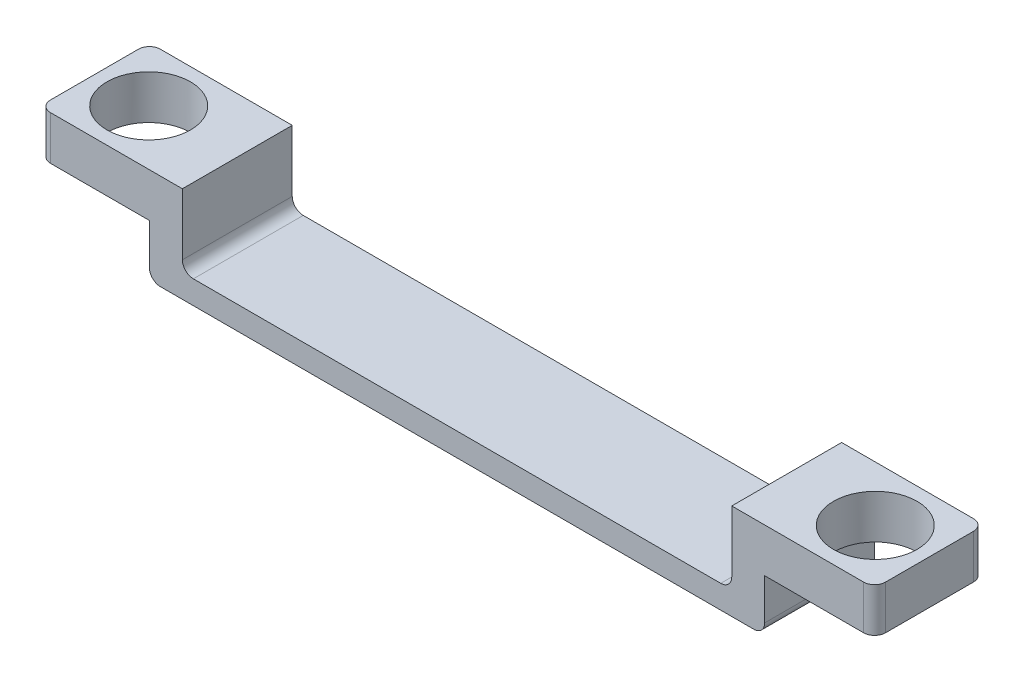
ISO-10303-21;
HEADER;
FILE_DESCRIPTION(('STEP AP214'),'2;1');
FILE_NAME('part.step','',(''),(''),'','','');
FILE_SCHEMA(('AUTOMOTIVE_DESIGN { 1 0 10303 214 1 1 1 1 }'));
ENDSEC;
DATA;
#1=APPLICATION_CONTEXT('core data for automotive mechanical design processes');
#2=APPLICATION_PROTOCOL_DEFINITION('international standard','automotive_design',2000,#1);
#3=PRODUCT_CONTEXT('',#1,'mechanical');
#4=PRODUCT('Part','Part','',(#3));
#5=PRODUCT_RELATED_PRODUCT_CATEGORY('part','',(#4));
#6=PRODUCT_DEFINITION_FORMATION('','',#4);
#7=PRODUCT_DEFINITION_CONTEXT('part definition',#1,'design');
#8=PRODUCT_DEFINITION('design','',#6,#7);
#9=PRODUCT_DEFINITION_SHAPE('','',#8);
#10=(LENGTH_UNIT() NAMED_UNIT(*) SI_UNIT(.MILLI.,.METRE.));
#11=(NAMED_UNIT(*) PLANE_ANGLE_UNIT() SI_UNIT($,.RADIAN.));
#12=(NAMED_UNIT(*) SI_UNIT($,.STERADIAN.) SOLID_ANGLE_UNIT());
#13=UNCERTAINTY_MEASURE_WITH_UNIT(LENGTH_MEASURE(1.E-05),#10,'distance_accuracy_value','');
#14=(GEOMETRIC_REPRESENTATION_CONTEXT(3) GLOBAL_UNCERTAINTY_ASSIGNED_CONTEXT((#13)) GLOBAL_UNIT_ASSIGNED_CONTEXT((#10,
#11,#12)) REPRESENTATION_CONTEXT('',''));
#15=CARTESIAN_POINT('',(0.,0.,0.));
#16=DIRECTION('',(0.,0.,1.));
#17=DIRECTION('',(1.,0.,0.));
#18=AXIS2_PLACEMENT_3D('',#15,#16,#17);
#19=CARTESIAN_POINT('',(22.3788372093023,2.89325581395349,5.));
#20=DIRECTION('',(-1.,0.,0.));
#21=DIRECTION('',(0.,-1.,0.));
#22=AXIS2_PLACEMENT_3D('',#19,#20,#21);
#23=PLANE('',#22);
#24=DIRECTION('',(0.,0.,1.));
#25=VECTOR('',#24,1.);
#26=CARTESIAN_POINT('',(22.3788372093023,0.89325581395349,0.));
#27=LINE('',#26,#25);
#28=CARTESIAN_POINT('',(22.3788372093023,0.89325581395349,0.));
#29=VERTEX_POINT('',#28);
#30=CARTESIAN_POINT('',(22.3788372093023,0.89325581395349,5.));
#31=VERTEX_POINT('',#30);
#32=EDGE_CURVE('E60',#29,#31,#27,.T.);
#33=ORIENTED_EDGE('',*,*,#32,.T.);
#34=DIRECTION('',(0.,1.,0.));
#35=VECTOR('',#34,1.);
#36=CARTESIAN_POINT('',(22.3788372093023,2.89325581395349,5.));
#37=LINE('',#36,#35);
#38=CARTESIAN_POINT('',(22.3788372093023,-0.965813953488363,5.));
#39=VERTEX_POINT('',#38);
#40=EDGE_CURVE('E275',#39,#31,#37,.T.);
#41=ORIENTED_EDGE('',*,*,#40,.F.);
#42=DIRECTION('',(0.,0.,-1.));
#43=VECTOR('',#42,1.);
#44=CARTESIAN_POINT('',(22.3788372093023,-0.965813953488363,5.));
#45=LINE('',#44,#43);
#46=CARTESIAN_POINT('',(22.3788372093023,-0.965813953488363,0.));
#47=VERTEX_POINT('',#46);
#48=EDGE_CURVE('E329',#39,#47,#45,.T.);
#49=ORIENTED_EDGE('',*,*,#48,.T.);
#50=DIRECTION('',(0.,1.,0.));
#51=VECTOR('',#50,1.);
#52=CARTESIAN_POINT('',(22.3788372093023,2.89325581395349,0.));
#53=LINE('',#52,#51);
#54=EDGE_CURVE('E297',#47,#29,#53,.T.);
#55=ORIENTED_EDGE('',*,*,#54,.T.);
#56=EDGE_LOOP('',(#33,#41,#49,#55));
#57=FACE_BOUND('',#56,.T.);
#58=ADVANCED_FACE('F43',(#57),#23,.F.);
#59=CARTESIAN_POINT('',(-5.62116279069767,-0.965813953488367,5.));
#60=DIRECTION('',(1.,0.,0.));
#61=DIRECTION('',(0.,0.,-1.));
#62=AXIS2_PLACEMENT_3D('',#59,#60,#61);
#63=PLANE('',#62);
#64=DIRECTION('',(0.,-1.,0.));
#65=VECTOR('',#64,1.);
#66=CARTESIAN_POINT('',(-5.62116279069767,-0.965813953488367,5.));
#67=LINE('',#66,#65);
#68=CARTESIAN_POINT('',(-5.62116279069767,0.89325581395349,5.));
#69=VERTEX_POINT('',#68);
#70=CARTESIAN_POINT('',(-5.62116279069767,-0.965813953488371,5.));
#71=VERTEX_POINT('',#70);
#72=EDGE_CURVE('E68',#69,#71,#67,.T.);
#73=ORIENTED_EDGE('',*,*,#72,.F.);
#74=DIRECTION('',(0.,0.,-1.));
#75=VECTOR('',#74,1.);
#76=CARTESIAN_POINT('',(-5.62116279069767,0.89325581395349,0.));
#77=LINE('',#76,#75);
#78=CARTESIAN_POINT('',(-5.62116279069767,0.89325581395349,0.));
#79=VERTEX_POINT('',#78);
#80=EDGE_CURVE('E193',#69,#79,#77,.T.);
#81=ORIENTED_EDGE('',*,*,#80,.T.);
#82=DIRECTION('',(0.,-1.,0.));
#83=VECTOR('',#82,1.);
#84=CARTESIAN_POINT('',(-5.62116279069767,-0.965813953488367,0.));
#85=LINE('',#84,#83);
#86=CARTESIAN_POINT('',(-5.62116279069767,-0.965813953488371,0.));
#87=VERTEX_POINT('',#86);
#88=EDGE_CURVE('E184',#79,#87,#85,.T.);
#89=ORIENTED_EDGE('',*,*,#88,.T.);
#90=DIRECTION('',(0.,0.,-1.));
#91=VECTOR('',#90,1.);
#92=CARTESIAN_POINT('',(-5.62116279069767,-0.965813953488371,5.));
#93=LINE('',#92,#91);
#94=EDGE_CURVE('E11',#71,#87,#93,.T.);
#95=ORIENTED_EDGE('',*,*,#94,.F.);
#96=EDGE_LOOP('',(#73,#81,#89,#95));
#97=FACE_BOUND('',#96,.T.);
#98=ADVANCED_FACE('F45',(#97),#63,.F.);
#99=CARTESIAN_POINT('',(-5.12116279069768,-0.965813953488371,5.));
#100=DIRECTION('',(0.,0.,-1.));
#101=DIRECTION('',(-1.,0.,0.));
#102=AXIS2_PLACEMENT_3D('',#99,#100,#101);
#103=CYLINDRICAL_SURFACE('',#102,0.5);
#104=CARTESIAN_POINT('',(-5.12116279069768,-0.965813953488371,0.));
#105=DIRECTION('',(0.,0.,1.));
#106=DIRECTION('',(-1.,0.,0.));
#107=AXIS2_PLACEMENT_3D('',#104,#105,#106);
#108=CIRCLE('',#107,0.5);
#109=CARTESIAN_POINT('',(-5.12116279069767,-1.46581395348837,0.));
#110=VERTEX_POINT('',#109);
#111=EDGE_CURVE('E190',#87,#110,#108,.T.);
#112=ORIENTED_EDGE('',*,*,#111,.T.);
#113=DIRECTION('',(0.,0.,-1.));
#114=VECTOR('',#113,1.);
#115=CARTESIAN_POINT('',(-5.12116279069767,-1.46581395348837,5.));
#116=LINE('',#115,#114);
#117=CARTESIAN_POINT('',(-5.12116279069767,-1.46581395348837,5.));
#118=VERTEX_POINT('',#117);
#119=EDGE_CURVE('E52',#118,#110,#116,.T.);
#120=ORIENTED_EDGE('',*,*,#119,.F.);
#121=CARTESIAN_POINT('',(-5.12116279069768,-0.965813953488371,5.));
#122=DIRECTION('',(0.,0.,1.));
#123=DIRECTION('',(-1.,0.,0.));
#124=AXIS2_PLACEMENT_3D('',#121,#122,#123);
#125=CIRCLE('',#124,0.5);
#126=EDGE_CURVE('E268',#71,#118,#125,.T.);
#127=ORIENTED_EDGE('',*,*,#126,.F.);
#128=ORIENTED_EDGE('',*,*,#94,.T.);
#129=EDGE_LOOP('',(#112,#120,#127,#128));
#130=FACE_BOUND('',#129,.T.);
#131=ADVANCED_FACE('F407',(#130),#103,.T.);
#132=CARTESIAN_POINT('',(21.8788372093023,-1.46581395348837,5.));
#133=DIRECTION('',(0.,1.,0.));
#134=DIRECTION('',(-1.,0.,0.));
#135=AXIS2_PLACEMENT_3D('',#132,#133,#134);
#136=PLANE('',#135);
#137=DIRECTION('',(1.,0.,0.));
#138=VECTOR('',#137,1.);
#139=CARTESIAN_POINT('',(21.8788372093023,-1.46581395348837,0.));
#140=LINE('',#139,#138);
#141=CARTESIAN_POINT('',(21.8788372093023,-1.46581395348837,0.));
#142=VERTEX_POINT('',#141);
#143=EDGE_CURVE('E293',#110,#142,#140,.T.);
#144=ORIENTED_EDGE('',*,*,#143,.T.);
#145=DIRECTION('',(0.,0.,-1.));
#146=VECTOR('',#145,1.);
#147=CARTESIAN_POINT('',(21.8788372093023,-1.46581395348837,5.));
#148=LINE('',#147,#146);
#149=CARTESIAN_POINT('',(21.8788372093023,-1.46581395348837,5.));
#150=VERTEX_POINT('',#149);
#151=EDGE_CURVE('E332',#150,#142,#148,.T.);
#152=ORIENTED_EDGE('',*,*,#151,.F.);
#153=DIRECTION('',(1.,0.,0.));
#154=VECTOR('',#153,1.);
#155=CARTESIAN_POINT('',(21.8788372093023,-1.46581395348837,5.));
#156=LINE('',#155,#154);
#157=EDGE_CURVE('E271',#118,#150,#156,.T.);
#158=ORIENTED_EDGE('',*,*,#157,.F.);
#159=ORIENTED_EDGE('',*,*,#119,.T.);
#160=EDGE_LOOP('',(#144,#152,#158,#159));
#161=FACE_BOUND('',#160,.T.);
#162=ADVANCED_FACE('F402',(#161),#136,.F.);
#163=CARTESIAN_POINT('',(21.8788372093023,-0.965813953488367,5.));
#164=DIRECTION('',(0.,0.,-1.));
#165=DIRECTION('',(-1.,0.,0.));
#166=AXIS2_PLACEMENT_3D('',#163,#164,#165);
#167=CYLINDRICAL_SURFACE('',#166,0.5);
#168=CARTESIAN_POINT('',(21.8788372093023,-0.965813953488367,0.));
#169=DIRECTION('',(0.,0.,1.));
#170=DIRECTION('',(-1.,0.,0.));
#171=AXIS2_PLACEMENT_3D('',#168,#169,#170);
#172=CIRCLE('',#171,0.5);
#173=EDGE_CURVE('E295',#142,#47,#172,.T.);
#174=ORIENTED_EDGE('',*,*,#173,.T.);
#175=ORIENTED_EDGE('',*,*,#48,.F.);
#176=CARTESIAN_POINT('',(21.8788372093023,-0.965813953488367,5.));
#177=DIRECTION('',(0.,0.,1.));
#178=DIRECTION('',(-1.,0.,0.));
#179=AXIS2_PLACEMENT_3D('',#176,#177,#178);
#180=CIRCLE('',#179,0.5);
#181=EDGE_CURVE('E273',#150,#39,#180,.T.);
#182=ORIENTED_EDGE('',*,*,#181,.F.);
#183=ORIENTED_EDGE('',*,*,#151,.T.);
#184=EDGE_LOOP('',(#174,#175,#182,#183));
#185=FACE_BOUND('',#184,.T.);
#186=ADVANCED_FACE('F357',(#185),#167,.T.);
#187=CARTESIAN_POINT('',(20.8788372093023,2.89325581395349,5.));
#188=DIRECTION('',(0.,-1.,0.));
#189=DIRECTION('',(0.,0.,-1.));
#190=AXIS2_PLACEMENT_3D('',#187,#188,#189);
#191=PLANE('',#190);
#192=CARTESIAN_POINT('',(24.911036665355,2.89325581395349,2.5));
#193=DIRECTION('',(0.,1.,0.));
#194=DIRECTION('',(0.,0.,-1.));
#195=AXIS2_PLACEMENT_3D('',#192,#193,#194);
#196=CIRCLE('',#195,1.9);
#197=CARTESIAN_POINT('',(24.911036665355,2.89325581395349,0.600000000000001));
#198=VERTEX_POINT('',#197);
#199=EDGE_CURVE('E343',#198,#198,#196,.T.);
#200=ORIENTED_EDGE('',*,*,#199,.F.);
#201=EDGE_LOOP('',(#200));
#202=FACE_BOUND('',#201,.T.);
#203=DIRECTION('',(-1.,0.,0.));
#204=VECTOR('',#203,1.);
#205=CARTESIAN_POINT('',(20.8788372093023,2.89325581395349,0.));
#206=LINE('',#205,#204);
#207=CARTESIAN_POINT('',(26.8788372093023,2.89325581395349,0.));
#208=VERTEX_POINT('',#207);
#209=CARTESIAN_POINT('',(20.8788372093023,2.89325581395349,0.));
#210=VERTEX_POINT('',#209);
#211=EDGE_CURVE('E299',#208,#210,#206,.T.);
#212=ORIENTED_EDGE('',*,*,#211,.T.);
#213=DIRECTION('',(0.,0.,-1.));
#214=VECTOR('',#213,1.);
#215=CARTESIAN_POINT('',(20.8788372093023,2.89325581395349,5.));
#216=LINE('',#215,#214);
#217=CARTESIAN_POINT('',(20.8788372093023,2.89325581395349,5.));
#218=VERTEX_POINT('',#217);
#219=EDGE_CURVE('E326',#218,#210,#216,.T.);
#220=ORIENTED_EDGE('',*,*,#219,.F.);
#221=DIRECTION('',(-1.,0.,0.));
#222=VECTOR('',#221,1.);
#223=CARTESIAN_POINT('',(20.8788372093023,2.89325581395349,5.));
#224=LINE('',#223,#222);
#225=CARTESIAN_POINT('',(26.8788372093023,2.89325581395349,5.));
#226=VERTEX_POINT('',#225);
#227=EDGE_CURVE('E277',#226,#218,#224,.T.);
#228=ORIENTED_EDGE('',*,*,#227,.F.);
#229=CARTESIAN_POINT('',(26.8788372093023,2.89325581395349,4.5));
#230=DIRECTION('',(0.,1.,0.));
#231=DIRECTION('',(0.,0.,1.));
#232=AXIS2_PLACEMENT_3D('',#229,#230,#231);
#233=CIRCLE('',#232,0.5);
#234=CARTESIAN_POINT('',(27.3788372093023,2.89325581395349,4.5));
#235=VERTEX_POINT('',#234);
#236=EDGE_CURVE('E221',#226,#235,#233,.T.);
#237=ORIENTED_EDGE('',*,*,#236,.T.);
#238=DIRECTION('',(0.,0.,-1.));
#239=VECTOR('',#238,1.);
#240=CARTESIAN_POINT('',(27.3788372093023,2.89325581395349,0.499999999999996));
#241=LINE('',#240,#239);
#242=CARTESIAN_POINT('',(27.3788372093023,2.89325581395349,0.499999999999996));
#243=VERTEX_POINT('',#242);
#244=EDGE_CURVE('E247',#235,#243,#241,.T.);
#245=ORIENTED_EDGE('',*,*,#244,.T.);
#246=CARTESIAN_POINT('',(26.8788372093023,2.89325581395349,0.499999999999996));
#247=DIRECTION('',(0.,1.,0.));
#248=DIRECTION('',(0.,0.,1.));
#249=AXIS2_PLACEMENT_3D('',#246,#247,#248);
#250=CIRCLE('',#249,0.5);
#251=EDGE_CURVE('E244',#243,#208,#250,.T.);
#252=ORIENTED_EDGE('',*,*,#251,.T.);
#253=EDGE_LOOP('',(#212,#220,#228,#237,#245,#252));
#254=FACE_BOUND('',#253,.T.);
#255=ADVANCED_FACE('F353',(#202,#254),#191,.F.);
#256=CARTESIAN_POINT('',(20.8788372093023,0.0932558139534927,5.));
#257=DIRECTION('',(1.,0.,0.));
#258=DIRECTION('',(0.,0.,-1.));
#259=AXIS2_PLACEMENT_3D('',#256,#257,#258);
#260=PLANE('',#259);
#261=DIRECTION('',(0.,-1.,0.));
#262=VECTOR('',#261,1.);
#263=CARTESIAN_POINT('',(20.8788372093023,0.0932558139534927,0.));
#264=LINE('',#263,#262);
#265=CARTESIAN_POINT('',(20.8788372093023,0.093255813953489,0.));
#266=VERTEX_POINT('',#265);
#267=EDGE_CURVE('E301',#210,#266,#264,.T.);
#268=ORIENTED_EDGE('',*,*,#267,.T.);
#269=DIRECTION('',(0.,0.,-1.));
#270=VECTOR('',#269,1.);
#271=CARTESIAN_POINT('',(20.8788372093023,0.093255813953489,5.));
#272=LINE('',#271,#270);
#273=CARTESIAN_POINT('',(20.8788372093023,0.093255813953489,5.));
#274=VERTEX_POINT('',#273);
#275=EDGE_CURVE('E323',#274,#266,#272,.T.);
#276=ORIENTED_EDGE('',*,*,#275,.F.);
#277=DIRECTION('',(0.,-1.,0.));
#278=VECTOR('',#277,1.);
#279=CARTESIAN_POINT('',(20.8788372093023,0.0932558139534927,5.));
#280=LINE('',#279,#278);
#281=EDGE_CURVE('E279',#218,#274,#280,.T.);
#282=ORIENTED_EDGE('',*,*,#281,.F.);
#283=ORIENTED_EDGE('',*,*,#219,.T.);
#284=EDGE_LOOP('',(#268,#276,#282,#283));
#285=FACE_BOUND('',#284,.T.);
#286=ADVANCED_FACE('F356',(#285),#260,.F.);
#287=CARTESIAN_POINT('',(20.3788372093023,0.093255813953489,5.));
#288=DIRECTION('',(0.,0.,-1.));
#289=DIRECTION('',(-1.,0.,0.));
#290=AXIS2_PLACEMENT_3D('',#287,#288,#289);
#291=CYLINDRICAL_SURFACE('',#290,0.5);
#292=CARTESIAN_POINT('',(20.3788372093023,0.093255813953489,0.));
#293=DIRECTION('',(0.,0.,-1.));
#294=DIRECTION('',(1.,0.,0.));
#295=AXIS2_PLACEMENT_3D('',#292,#293,#294);
#296=CIRCLE('',#295,0.5);
#297=CARTESIAN_POINT('',(20.3788372093023,-0.406744186046511,0.));
#298=VERTEX_POINT('',#297);
#299=EDGE_CURVE('E303',#266,#298,#296,.T.);
#300=ORIENTED_EDGE('',*,*,#299,.T.);
#301=DIRECTION('',(0.,0.,-1.));
#302=VECTOR('',#301,1.);
#303=CARTESIAN_POINT('',(20.3788372093023,-0.406744186046511,5.));
#304=LINE('',#303,#302);
#305=CARTESIAN_POINT('',(20.3788372093023,-0.406744186046511,5.));
#306=VERTEX_POINT('',#305);
#307=EDGE_CURVE('E320',#306,#298,#304,.T.);
#308=ORIENTED_EDGE('',*,*,#307,.F.);
#309=CARTESIAN_POINT('',(20.3788372093023,0.093255813953489,5.));
#310=DIRECTION('',(0.,0.,-1.));
#311=DIRECTION('',(1.,0.,0.));
#312=AXIS2_PLACEMENT_3D('',#309,#310,#311);
#313=CIRCLE('',#312,0.5);
#314=EDGE_CURVE('E281',#274,#306,#313,.T.);
#315=ORIENTED_EDGE('',*,*,#314,.F.);
#316=ORIENTED_EDGE('',*,*,#275,.T.);
#317=EDGE_LOOP('',(#300,#308,#315,#316));
#318=FACE_BOUND('',#317,.T.);
#319=ADVANCED_FACE('F370',(#318),#291,.F.);
#320=CARTESIAN_POINT('',(-3.62116279069767,-0.406744186046511,5.));
#321=DIRECTION('',(0.,-1.,0.));
#322=DIRECTION('',(0.,0.,-1.));
#323=AXIS2_PLACEMENT_3D('',#320,#321,#322);
#324=PLANE('',#323);
#325=DIRECTION('',(-1.,0.,0.));
#326=VECTOR('',#325,1.);
#327=CARTESIAN_POINT('',(-3.62116279069767,-0.406744186046511,0.));
#328=LINE('',#327,#326);
#329=CARTESIAN_POINT('',(-3.62116279069767,-0.406744186046511,0.));
#330=VERTEX_POINT('',#329);
#331=EDGE_CURVE('E305',#298,#330,#328,.T.);
#332=ORIENTED_EDGE('',*,*,#331,.T.);
#333=DIRECTION('',(0.,0.,-1.));
#334=VECTOR('',#333,1.);
#335=CARTESIAN_POINT('',(-3.62116279069767,-0.406744186046511,5.));
#336=LINE('',#335,#334);
#337=CARTESIAN_POINT('',(-3.62116279069767,-0.406744186046511,5.));
#338=VERTEX_POINT('',#337);
#339=EDGE_CURVE('E317',#338,#330,#336,.T.);
#340=ORIENTED_EDGE('',*,*,#339,.F.);
#341=DIRECTION('',(-1.,0.,0.));
#342=VECTOR('',#341,1.);
#343=CARTESIAN_POINT('',(-3.62116279069767,-0.406744186046511,5.));
#344=LINE('',#343,#342);
#345=EDGE_CURVE('E283',#306,#338,#344,.T.);
#346=ORIENTED_EDGE('',*,*,#345,.F.);
#347=ORIENTED_EDGE('',*,*,#307,.T.);
#348=EDGE_LOOP('',(#332,#340,#346,#347));
#349=FACE_BOUND('',#348,.T.);
#350=ADVANCED_FACE('F374',(#349),#324,.F.);
#351=CARTESIAN_POINT('',(-3.62116279069768,0.093255813953489,5.));
#352=DIRECTION('',(0.,0.,-1.));
#353=DIRECTION('',(-1.,0.,0.));
#354=AXIS2_PLACEMENT_3D('',#351,#352,#353);
#355=CYLINDRICAL_SURFACE('',#354,0.5);
#356=CARTESIAN_POINT('',(-3.62116279069768,0.093255813953489,0.));
#357=DIRECTION('',(0.,0.,-1.));
#358=DIRECTION('',(1.,0.,0.));
#359=AXIS2_PLACEMENT_3D('',#356,#357,#358);
#360=CIRCLE('',#359,0.5);
#361=CARTESIAN_POINT('',(-4.12116279069768,0.0932558139534927,0.));
#362=VERTEX_POINT('',#361);
#363=EDGE_CURVE('E307',#330,#362,#360,.T.);
#364=ORIENTED_EDGE('',*,*,#363,.T.);
#365=DIRECTION('',(0.,0.,-1.));
#366=VECTOR('',#365,1.);
#367=CARTESIAN_POINT('',(-4.12116279069768,0.0932558139534927,5.));
#368=LINE('',#367,#366);
#369=CARTESIAN_POINT('',(-4.12116279069768,0.0932558139534927,5.));
#370=VERTEX_POINT('',#369);
#371=EDGE_CURVE('E314',#370,#362,#368,.T.);
#372=ORIENTED_EDGE('',*,*,#371,.F.);
#373=CARTESIAN_POINT('',(-3.62116279069768,0.093255813953489,5.));
#374=DIRECTION('',(0.,0.,-1.));
#375=DIRECTION('',(1.,0.,0.));
#376=AXIS2_PLACEMENT_3D('',#373,#374,#375);
#377=CIRCLE('',#376,0.5);
#378=EDGE_CURVE('E285',#338,#370,#377,.T.);
#379=ORIENTED_EDGE('',*,*,#378,.F.);
#380=ORIENTED_EDGE('',*,*,#339,.T.);
#381=EDGE_LOOP('',(#364,#372,#379,#380));
#382=FACE_BOUND('',#381,.T.);
#383=ADVANCED_FACE('F427',(#382),#355,.F.);
#384=CARTESIAN_POINT('',(-4.12116279069768,2.89325581395349,5.));
#385=DIRECTION('',(-1.,0.,0.));
#386=DIRECTION('',(0.,0.,1.));
#387=AXIS2_PLACEMENT_3D('',#384,#385,#386);
#388=PLANE('',#387);
#389=DIRECTION('',(0.,1.,0.));
#390=VECTOR('',#389,1.);
#391=CARTESIAN_POINT('',(-4.12116279069768,2.89325581395349,0.));
#392=LINE('',#391,#390);
#393=CARTESIAN_POINT('',(-4.12116279069768,2.89325581395349,0.));
#394=VERTEX_POINT('',#393);
#395=EDGE_CURVE('E309',#362,#394,#392,.T.);
#396=ORIENTED_EDGE('',*,*,#395,.T.);
#397=DIRECTION('',(0.,0.,-1.));
#398=VECTOR('',#397,1.);
#399=CARTESIAN_POINT('',(-4.12116279069768,2.89325581395349,5.));
#400=LINE('',#399,#398);
#401=CARTESIAN_POINT('',(-4.12116279069768,2.89325581395349,5.));
#402=VERTEX_POINT('',#401);
#403=EDGE_CURVE('E290',#402,#394,#400,.T.);
#404=ORIENTED_EDGE('',*,*,#403,.F.);
#405=DIRECTION('',(0.,1.,0.));
#406=VECTOR('',#405,1.);
#407=CARTESIAN_POINT('',(-4.12116279069768,2.89325581395349,5.));
#408=LINE('',#407,#406);
#409=EDGE_CURVE('E287',#370,#402,#408,.T.);
#410=ORIENTED_EDGE('',*,*,#409,.F.);
#411=ORIENTED_EDGE('',*,*,#371,.T.);
#412=EDGE_LOOP('',(#396,#404,#410,#411));
#413=FACE_BOUND('',#412,.T.);
#414=ADVANCED_FACE('F425',(#413),#388,.F.);
#415=CARTESIAN_POINT('',(-5.62116279069767,2.89325581395349,5.));
#416=DIRECTION('',(0.,-1.,0.));
#417=DIRECTION('',(0.,0.,-1.));
#418=AXIS2_PLACEMENT_3D('',#415,#416,#417);
#419=PLANE('',#418);
#420=CARTESIAN_POINT('',(-8.15336224675038,2.89325581395349,2.5));
#421=DIRECTION('',(0.,1.,0.));
#422=DIRECTION('',(0.,0.,1.));
#423=AXIS2_PLACEMENT_3D('',#420,#421,#422);
#424=CIRCLE('',#423,1.9);
#425=CARTESIAN_POINT('',(-8.15336224675038,2.89325581395349,4.4));
#426=VERTEX_POINT('',#425);
#427=EDGE_CURVE('E338',#426,#426,#424,.T.);
#428=ORIENTED_EDGE('',*,*,#427,.F.);
#429=EDGE_LOOP('',(#428));
#430=FACE_BOUND('',#429,.T.);
#431=DIRECTION('',(-1.,0.,0.));
#432=VECTOR('',#431,1.);
#433=CARTESIAN_POINT('',(-5.62116279069767,2.89325581395349,0.));
#434=LINE('',#433,#432);
#435=CARTESIAN_POINT('',(-10.1211627906977,2.89325581395349,0.));
#436=VERTEX_POINT('',#435);
#437=EDGE_CURVE('E269',#394,#436,#434,.T.);
#438=ORIENTED_EDGE('',*,*,#437,.T.);
#439=CARTESIAN_POINT('',(-10.1211627906977,2.89325581395349,0.500000000000001));
#440=DIRECTION('',(0.,1.,0.));
#441=DIRECTION('',(0.,0.,1.));
#442=AXIS2_PLACEMENT_3D('',#439,#440,#441);
#443=CIRCLE('',#442,0.5);
#444=CARTESIAN_POINT('',(-10.6211627906977,2.89325581395349,0.5));
#445=VERTEX_POINT('',#444);
#446=EDGE_CURVE('E217',#436,#445,#443,.T.);
#447=ORIENTED_EDGE('',*,*,#446,.T.);
#448=DIRECTION('',(0.,0.,1.));
#449=VECTOR('',#448,1.);
#450=CARTESIAN_POINT('',(-10.6211627906977,2.89325581395349,0.500000000000001));
#451=LINE('',#450,#449);
#452=CARTESIAN_POINT('',(-10.6211627906977,2.89325581395349,4.5));
#453=VERTEX_POINT('',#452);
#454=EDGE_CURVE('E220',#445,#453,#451,.T.);
#455=ORIENTED_EDGE('',*,*,#454,.T.);
#456=CARTESIAN_POINT('',(-10.1211627906977,2.89325581395349,4.5));
#457=DIRECTION('',(0.,1.,0.));
#458=DIRECTION('',(0.,0.,-1.));
#459=AXIS2_PLACEMENT_3D('',#456,#457,#458);
#460=CIRCLE('',#459,0.5);
#461=CARTESIAN_POINT('',(-10.1211627906977,2.89325581395349,5.));
#462=VERTEX_POINT('',#461);
#463=EDGE_CURVE('E197',#453,#462,#460,.T.);
#464=ORIENTED_EDGE('',*,*,#463,.T.);
#465=DIRECTION('',(-1.,0.,0.));
#466=VECTOR('',#465,1.);
#467=CARTESIAN_POINT('',(-5.62116279069767,2.89325581395349,5.));
#468=LINE('',#467,#466);
#469=EDGE_CURVE('E289',#402,#462,#468,.T.);
#470=ORIENTED_EDGE('',*,*,#469,.F.);
#471=ORIENTED_EDGE('',*,*,#403,.T.);
#472=EDGE_LOOP('',(#438,#447,#455,#464,#470,#471));
#473=FACE_BOUND('',#472,.T.);
#474=ADVANCED_FACE('F420',(#430,#473),#419,.F.);
#475=CARTESIAN_POINT('',(-3.62116279069768,0.093255813953489,5.));
#476=DIRECTION('',(0.,0.,1.));
#477=DIRECTION('',(1.,0.,0.));
#478=AXIS2_PLACEMENT_3D('',#475,#476,#477);
#479=PLANE('',#478);
#480=ORIENTED_EDGE('',*,*,#469,.T.);
#481=DIRECTION('',(0.,1.,0.));
#482=VECTOR('',#481,1.);
#483=CARTESIAN_POINT('',(-10.1211627906977,0.89325581395349,5.));
#484=LINE('',#483,#482);
#485=CARTESIAN_POINT('',(-10.1211627906977,0.89325581395349,5.));
#486=VERTEX_POINT('',#485);
#487=EDGE_CURVE('E191',#486,#462,#484,.T.);
#488=ORIENTED_EDGE('',*,*,#487,.F.);
#489=DIRECTION('',(1.,0.,0.));
#490=VECTOR('',#489,1.);
#491=CARTESIAN_POINT('',(-5.62116279069767,0.89325581395349,5.));
#492=LINE('',#491,#490);
#493=EDGE_CURVE('E214',#486,#69,#492,.T.);
#494=ORIENTED_EDGE('',*,*,#493,.T.);
#495=ORIENTED_EDGE('',*,*,#72,.T.);
#496=ORIENTED_EDGE('',*,*,#126,.T.);
#497=ORIENTED_EDGE('',*,*,#157,.T.);
#498=ORIENTED_EDGE('',*,*,#181,.T.);
#499=ORIENTED_EDGE('',*,*,#40,.T.);
#500=DIRECTION('',(1.,0.,0.));
#501=VECTOR('',#500,1.);
#502=CARTESIAN_POINT('',(22.3788372093023,0.89325581395349,5.));
#503=LINE('',#502,#501);
#504=CARTESIAN_POINT('',(26.8788372093023,0.89325581395349,5.));
#505=VERTEX_POINT('',#504);
#506=EDGE_CURVE('E263',#31,#505,#503,.T.);
#507=ORIENTED_EDGE('',*,*,#506,.T.);
#508=DIRECTION('',(0.,1.,0.));
#509=VECTOR('',#508,1.);
#510=CARTESIAN_POINT('',(26.8788372093023,0.89325581395349,5.));
#511=LINE('',#510,#509);
#512=EDGE_CURVE('E233',#505,#226,#511,.T.);
#513=ORIENTED_EDGE('',*,*,#512,.T.);
#514=ORIENTED_EDGE('',*,*,#227,.T.);
#515=ORIENTED_EDGE('',*,*,#281,.T.);
#516=ORIENTED_EDGE('',*,*,#314,.T.);
#517=ORIENTED_EDGE('',*,*,#345,.T.);
#518=ORIENTED_EDGE('',*,*,#378,.T.);
#519=ORIENTED_EDGE('',*,*,#409,.T.);
#520=EDGE_LOOP('',(#480,#488,#494,#495,#496,#497,#498,#499,#507,#513,#514,#515,#516,#517,#518,#519));
#521=FACE_BOUND('',#520,.T.);
#522=ADVANCED_FACE('F378',(#521),#479,.T.);
#523=CARTESIAN_POINT('',(-3.62116279069768,0.093255813953489,0.));
#524=DIRECTION('',(0.,0.,1.));
#525=DIRECTION('',(1.,0.,0.));
#526=AXIS2_PLACEMENT_3D('',#523,#524,#525);
#527=PLANE('',#526);
#528=ORIENTED_EDGE('',*,*,#88,.F.);
#529=DIRECTION('',(-1.,0.,0.));
#530=VECTOR('',#529,1.);
#531=CARTESIAN_POINT('',(-5.62116279069767,0.89325581395349,0.));
#532=LINE('',#531,#530);
#533=CARTESIAN_POINT('',(-10.1211627906977,0.89325581395349,0.));
#534=VERTEX_POINT('',#533);
#535=EDGE_CURVE('E188',#79,#534,#532,.T.);
#536=ORIENTED_EDGE('',*,*,#535,.T.);
#537=DIRECTION('',(0.,1.,0.));
#538=VECTOR('',#537,1.);
#539=CARTESIAN_POINT('',(-10.1211627906977,0.89325581395349,0.));
#540=LINE('',#539,#538);
#541=EDGE_CURVE('E216',#534,#436,#540,.T.);
#542=ORIENTED_EDGE('',*,*,#541,.T.);
#543=ORIENTED_EDGE('',*,*,#437,.F.);
#544=ORIENTED_EDGE('',*,*,#395,.F.);
#545=ORIENTED_EDGE('',*,*,#363,.F.);
#546=ORIENTED_EDGE('',*,*,#331,.F.);
#547=ORIENTED_EDGE('',*,*,#299,.F.);
#548=ORIENTED_EDGE('',*,*,#267,.F.);
#549=ORIENTED_EDGE('',*,*,#211,.F.);
#550=DIRECTION('',(0.,1.,0.));
#551=VECTOR('',#550,1.);
#552=CARTESIAN_POINT('',(26.8788372093023,0.89325581395349,0.));
#553=LINE('',#552,#551);
#554=CARTESIAN_POINT('',(26.8788372093023,0.89325581395349,0.));
#555=VERTEX_POINT('',#554);
#556=EDGE_CURVE('E241',#555,#208,#553,.T.);
#557=ORIENTED_EDGE('',*,*,#556,.F.);
#558=DIRECTION('',(-1.,0.,0.));
#559=VECTOR('',#558,1.);
#560=CARTESIAN_POINT('',(22.3788372093023,0.89325581395349,0.));
#561=LINE('',#560,#559);
#562=EDGE_CURVE('E236',#555,#29,#561,.T.);
#563=ORIENTED_EDGE('',*,*,#562,.T.);
#564=ORIENTED_EDGE('',*,*,#54,.F.);
#565=ORIENTED_EDGE('',*,*,#173,.F.);
#566=ORIENTED_EDGE('',*,*,#143,.F.);
#567=ORIENTED_EDGE('',*,*,#111,.F.);
#568=EDGE_LOOP('',(#528,#536,#542,#543,#544,#545,#546,#547,#548,#549,#557,#563,#564,#565,#566,#567));
#569=FACE_BOUND('',#568,.T.);
#570=ADVANCED_FACE('F185',(#569),#527,.F.);
#571=CARTESIAN_POINT('',(26.8788372093023,0.89325581395349,0.499999999999996));
#572=DIRECTION('',(0.,1.,0.));
#573=DIRECTION('',(0.,0.,1.));
#574=AXIS2_PLACEMENT_3D('',#571,#572,#573);
#575=CYLINDRICAL_SURFACE('',#574,0.5);
#576=ORIENTED_EDGE('',*,*,#251,.F.);
#577=DIRECTION('',(0.,1.,0.));
#578=VECTOR('',#577,1.);
#579=CARTESIAN_POINT('',(27.3788372093023,0.89325581395349,0.499999999999996));
#580=LINE('',#579,#578);
#581=CARTESIAN_POINT('',(27.3788372093023,0.89325581395349,0.499999999999996));
#582=VERTEX_POINT('',#581);
#583=EDGE_CURVE('E239',#582,#243,#580,.T.);
#584=ORIENTED_EDGE('',*,*,#583,.F.);
#585=CARTESIAN_POINT('',(26.8788372093023,0.89325581395349,0.499999999999996));
#586=DIRECTION('',(0.,1.,0.));
#587=DIRECTION('',(0.,0.,1.));
#588=AXIS2_PLACEMENT_3D('',#585,#586,#587);
#589=CIRCLE('',#588,0.5);
#590=EDGE_CURVE('E254',#582,#555,#589,.T.);
#591=ORIENTED_EDGE('',*,*,#590,.T.);
#592=ORIENTED_EDGE('',*,*,#556,.T.);
#593=EDGE_LOOP('',(#576,#584,#591,#592));
#594=FACE_BOUND('',#593,.T.);
#595=ADVANCED_FACE('F390',(#594),#575,.T.);
#596=CARTESIAN_POINT('',(27.3788372093023,0.89325581395349,0.499999999999996));
#597=DIRECTION('',(1.,0.,0.));
#598=DIRECTION('',(0.,0.,-1.));
#599=AXIS2_PLACEMENT_3D('',#596,#597,#598);
#600=PLANE('',#599);
#601=ORIENTED_EDGE('',*,*,#244,.F.);
#602=DIRECTION('',(0.,1.,0.));
#603=VECTOR('',#602,1.);
#604=CARTESIAN_POINT('',(27.3788372093023,0.89325581395349,4.5));
#605=LINE('',#604,#603);
#606=CARTESIAN_POINT('',(27.3788372093023,0.89325581395349,4.5));
#607=VERTEX_POINT('',#606);
#608=EDGE_CURVE('E237',#607,#235,#605,.T.);
#609=ORIENTED_EDGE('',*,*,#608,.F.);
#610=DIRECTION('',(0.,0.,-1.));
#611=VECTOR('',#610,1.);
#612=CARTESIAN_POINT('',(27.3788372093023,0.89325581395349,0.499999999999996));
#613=LINE('',#612,#611);
#614=EDGE_CURVE('E257',#607,#582,#613,.T.);
#615=ORIENTED_EDGE('',*,*,#614,.T.);
#616=ORIENTED_EDGE('',*,*,#583,.T.);
#617=EDGE_LOOP('',(#601,#609,#615,#616));
#618=FACE_BOUND('',#617,.T.);
#619=ADVANCED_FACE('F387',(#618),#600,.T.);
#620=CARTESIAN_POINT('',(26.8788372093023,0.89325581395349,4.5));
#621=DIRECTION('',(0.,1.,0.));
#622=DIRECTION('',(0.,0.,1.));
#623=AXIS2_PLACEMENT_3D('',#620,#621,#622);
#624=CYLINDRICAL_SURFACE('',#623,0.5);
#625=ORIENTED_EDGE('',*,*,#236,.F.);
#626=ORIENTED_EDGE('',*,*,#512,.F.);
#627=CARTESIAN_POINT('',(26.8788372093023,0.89325581395349,4.5));
#628=DIRECTION('',(0.,1.,0.));
#629=DIRECTION('',(0.,0.,1.));
#630=AXIS2_PLACEMENT_3D('',#627,#628,#629);
#631=CIRCLE('',#630,0.5);
#632=EDGE_CURVE('E260',#505,#607,#631,.T.);
#633=ORIENTED_EDGE('',*,*,#632,.T.);
#634=ORIENTED_EDGE('',*,*,#608,.T.);
#635=EDGE_LOOP('',(#625,#626,#633,#634));
#636=FACE_BOUND('',#635,.T.);
#637=ADVANCED_FACE('F383',(#636),#624,.T.);
#638=CARTESIAN_POINT('',(26.8788372093023,0.89325581395349,4.5));
#639=DIRECTION('',(0.,1.,0.));
#640=DIRECTION('',(0.,0.,1.));
#641=AXIS2_PLACEMENT_3D('',#638,#639,#640);
#642=PLANE('',#641);
#643=CARTESIAN_POINT('',(24.911036665355,0.89325581395349,2.5));
#644=DIRECTION('',(0.,1.,0.));
#645=DIRECTION('',(0.,0.,1.));
#646=AXIS2_PLACEMENT_3D('',#643,#644,#645);
#647=CIRCLE('',#646,1.9);
#648=CARTESIAN_POINT('',(24.911036665355,0.89325581395349,4.4));
#649=VERTEX_POINT('',#648);
#650=EDGE_CURVE('E47',#649,#649,#647,.T.);
#651=ORIENTED_EDGE('',*,*,#650,.T.);
#652=EDGE_LOOP('',(#651));
#653=FACE_BOUND('',#652,.T.);
#654=ORIENTED_EDGE('',*,*,#32,.F.);
#655=ORIENTED_EDGE('',*,*,#562,.F.);
#656=ORIENTED_EDGE('',*,*,#590,.F.);
#657=ORIENTED_EDGE('',*,*,#614,.F.);
#658=ORIENTED_EDGE('',*,*,#632,.F.);
#659=ORIENTED_EDGE('',*,*,#506,.F.);
#660=EDGE_LOOP('',(#654,#655,#656,#657,#658,#659));
#661=FACE_BOUND('',#660,.T.);
#662=ADVANCED_FACE('F395',(#653,#661),#642,.F.);
#663=CARTESIAN_POINT('',(-10.1211627906977,0.89325581395349,4.5));
#664=DIRECTION('',(0.,1.,0.));
#665=DIRECTION('',(0.,0.,1.));
#666=AXIS2_PLACEMENT_3D('',#663,#664,#665);
#667=CYLINDRICAL_SURFACE('',#666,0.5);
#668=ORIENTED_EDGE('',*,*,#463,.F.);
#669=DIRECTION('',(0.,1.,0.));
#670=VECTOR('',#669,1.);
#671=CARTESIAN_POINT('',(-10.6211627906977,0.89325581395349,4.5));
#672=LINE('',#671,#670);
#673=CARTESIAN_POINT('',(-10.6211627906977,0.89325581395349,4.5));
#674=VERTEX_POINT('',#673);
#675=EDGE_CURVE('E228',#674,#453,#672,.T.);
#676=ORIENTED_EDGE('',*,*,#675,.F.);
#677=CARTESIAN_POINT('',(-10.1211627906977,0.89325581395349,4.5));
#678=DIRECTION('',(0.,1.,0.));
#679=DIRECTION('',(0.,0.,-1.));
#680=AXIS2_PLACEMENT_3D('',#677,#678,#679);
#681=CIRCLE('',#680,0.5);
#682=EDGE_CURVE('E211',#674,#486,#681,.T.);
#683=ORIENTED_EDGE('',*,*,#682,.T.);
#684=ORIENTED_EDGE('',*,*,#487,.T.);
#685=EDGE_LOOP('',(#668,#676,#683,#684));
#686=FACE_BOUND('',#685,.T.);
#687=ADVANCED_FACE('F547',(#686),#667,.T.);
#688=CARTESIAN_POINT('',(-10.6211627906977,0.89325581395349,0.500000000000001));
#689=DIRECTION('',(-1.,0.,0.));
#690=DIRECTION('',(0.,0.,1.));
#691=AXIS2_PLACEMENT_3D('',#688,#689,#690);
#692=PLANE('',#691);
#693=ORIENTED_EDGE('',*,*,#454,.F.);
#694=DIRECTION('',(0.,1.,0.));
#695=VECTOR('',#694,1.);
#696=CARTESIAN_POINT('',(-10.6211627906977,0.89325581395349,0.5));
#697=LINE('',#696,#695);
#698=CARTESIAN_POINT('',(-10.6211627906977,0.89325581395349,0.5));
#699=VERTEX_POINT('',#698);
#700=EDGE_CURVE('E230',#699,#445,#697,.T.);
#701=ORIENTED_EDGE('',*,*,#700,.F.);
#702=DIRECTION('',(0.,0.,1.));
#703=VECTOR('',#702,1.);
#704=CARTESIAN_POINT('',(-10.6211627906977,0.89325581395349,0.500000000000001));
#705=LINE('',#704,#703);
#706=EDGE_CURVE('E205',#699,#674,#705,.T.);
#707=ORIENTED_EDGE('',*,*,#706,.T.);
#708=ORIENTED_EDGE('',*,*,#675,.T.);
#709=EDGE_LOOP('',(#693,#701,#707,#708));
#710=FACE_BOUND('',#709,.T.);
#711=ADVANCED_FACE('F412',(#710),#692,.T.);
#712=CARTESIAN_POINT('',(-10.1211627906977,0.89325581395349,0.500000000000001));
#713=DIRECTION('',(0.,1.,0.));
#714=DIRECTION('',(0.,0.,1.));
#715=AXIS2_PLACEMENT_3D('',#712,#713,#714);
#716=CYLINDRICAL_SURFACE('',#715,0.5);
#717=ORIENTED_EDGE('',*,*,#446,.F.);
#718=ORIENTED_EDGE('',*,*,#541,.F.);
#719=CARTESIAN_POINT('',(-10.1211627906977,0.89325581395349,0.500000000000001));
#720=DIRECTION('',(0.,1.,0.));
#721=DIRECTION('',(0.,0.,1.));
#722=AXIS2_PLACEMENT_3D('',#719,#720,#721);
#723=CIRCLE('',#722,0.5);
#724=EDGE_CURVE('E203',#534,#699,#723,.T.);
#725=ORIENTED_EDGE('',*,*,#724,.T.);
#726=ORIENTED_EDGE('',*,*,#700,.T.);
#727=EDGE_LOOP('',(#717,#718,#725,#726));
#728=FACE_BOUND('',#727,.T.);
#729=ADVANCED_FACE('F416',(#728),#716,.T.);
#730=CARTESIAN_POINT('',(-10.1211627906977,0.89325581395349,4.5));
#731=DIRECTION('',(0.,-1.,0.));
#732=DIRECTION('',(0.,0.,-1.));
#733=AXIS2_PLACEMENT_3D('',#730,#731,#732);
#734=PLANE('',#733);
#735=CARTESIAN_POINT('',(-8.15336224675038,0.89325581395349,2.5));
#736=DIRECTION('',(0.,-1.,0.));
#737=DIRECTION('',(0.,0.,-1.));
#738=AXIS2_PLACEMENT_3D('',#735,#736,#737);
#739=CIRCLE('',#738,1.9);
#740=CARTESIAN_POINT('',(-8.15336224675038,0.89325581395349,0.6));
#741=VERTEX_POINT('',#740);
#742=EDGE_CURVE('E336',#741,#741,#739,.T.);
#743=ORIENTED_EDGE('',*,*,#742,.F.);
#744=EDGE_LOOP('',(#743));
#745=FACE_BOUND('',#744,.T.);
#746=ORIENTED_EDGE('',*,*,#80,.F.);
#747=ORIENTED_EDGE('',*,*,#493,.F.);
#748=ORIENTED_EDGE('',*,*,#682,.F.);
#749=ORIENTED_EDGE('',*,*,#706,.F.);
#750=ORIENTED_EDGE('',*,*,#724,.F.);
#751=ORIENTED_EDGE('',*,*,#535,.F.);
#752=EDGE_LOOP('',(#746,#747,#748,#749,#750,#751));
#753=FACE_BOUND('',#752,.T.);
#754=ADVANCED_FACE('F200',(#745,#753),#734,.T.);
#755=CARTESIAN_POINT('',(-8.15336224675038,-2.10674418604651,2.5));
#756=DIRECTION('',(0.,1.,0.));
#757=DIRECTION('',(0.,0.,1.));
#758=AXIS2_PLACEMENT_3D('',#755,#756,#757);
#759=CYLINDRICAL_SURFACE('',#758,1.9);
#760=ORIENTED_EDGE('',*,*,#742,.T.);
#761=EDGE_LOOP('',(#760));
#762=FACE_BOUND('',#761,.T.);
#763=ORIENTED_EDGE('',*,*,#427,.T.);
#764=EDGE_LOOP('',(#763));
#765=FACE_BOUND('',#764,.T.);
#766=ADVANCED_FACE('F558',(#762,#765),#759,.F.);
#767=CARTESIAN_POINT('',(24.911036665355,-2.10674418604651,2.5));
#768=DIRECTION('',(0.,1.,0.));
#769=DIRECTION('',(0.,0.,1.));
#770=AXIS2_PLACEMENT_3D('',#767,#768,#769);
#771=CYLINDRICAL_SURFACE('',#770,1.9);
#772=ORIENTED_EDGE('',*,*,#199,.T.);
#773=EDGE_LOOP('',(#772));
#774=FACE_BOUND('',#773,.T.);
#775=ORIENTED_EDGE('',*,*,#650,.F.);
#776=EDGE_LOOP('',(#775));
#777=FACE_BOUND('',#776,.T.);
#778=ADVANCED_FACE('F350',(#774,#777),#771,.F.);
#779=CLOSED_SHELL('',(#58,#98,#131,#162,#186,#255,#286,#319,#350,#383,#414,#474,#522,#570,#595,
#619,#637,#662,#687,#711,#729,#754,#766,#778));
#780=MANIFOLD_SOLID_BREP('B2',#779);
#781=ADVANCED_BREP_SHAPE_REPRESENTATION('',(#18,#780),#14);
#782=SHAPE_DEFINITION_REPRESENTATION(#9,#781);
ENDSEC;
END-ISO-10303-21;
